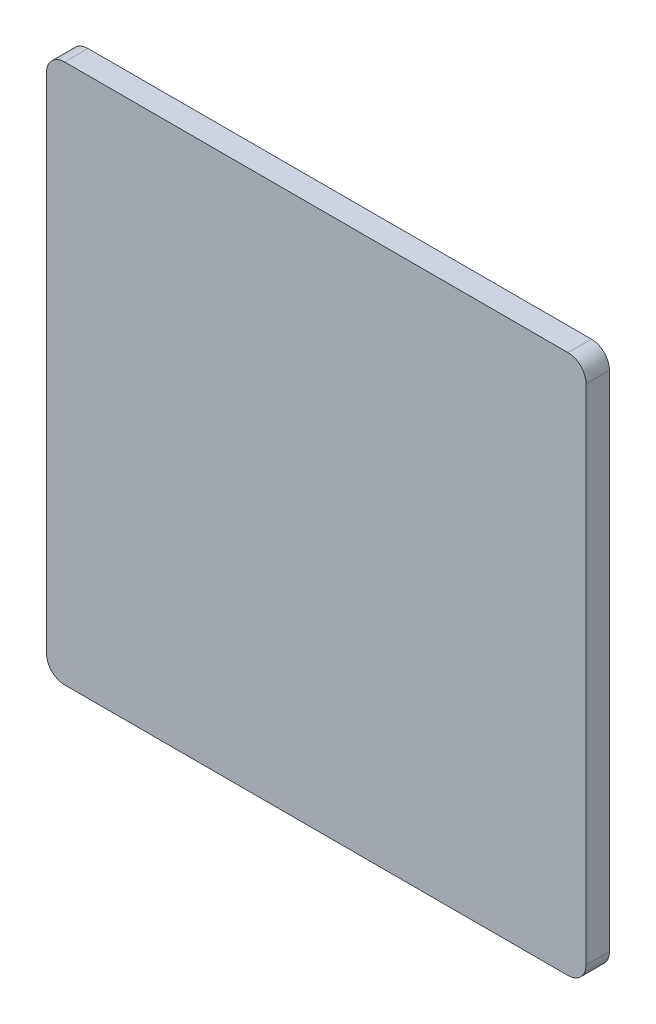
ISO-10303-21;
HEADER;
FILE_DESCRIPTION(('STEP AP214'),'2;1');
FILE_NAME('part.step','',(''),(''),'','','');
FILE_SCHEMA(('AUTOMOTIVE_DESIGN { 1 0 10303 214 1 1 1 1 }'));
ENDSEC;
DATA;
#1=APPLICATION_CONTEXT('core data for automotive mechanical design processes');
#2=APPLICATION_PROTOCOL_DEFINITION('international standard','automotive_design',2000,#1);
#3=PRODUCT_CONTEXT('',#1,'mechanical');
#4=PRODUCT('Part','Part','',(#3));
#5=PRODUCT_RELATED_PRODUCT_CATEGORY('part','',(#4));
#6=PRODUCT_DEFINITION_FORMATION('','',#4);
#7=PRODUCT_DEFINITION_CONTEXT('part definition',#1,'design');
#8=PRODUCT_DEFINITION('design','',#6,#7);
#9=PRODUCT_DEFINITION_SHAPE('','',#8);
#10=(LENGTH_UNIT() NAMED_UNIT(*) SI_UNIT(.MILLI.,.METRE.));
#11=(NAMED_UNIT(*) PLANE_ANGLE_UNIT() SI_UNIT($,.RADIAN.));
#12=(NAMED_UNIT(*) SI_UNIT($,.STERADIAN.) SOLID_ANGLE_UNIT());
#13=UNCERTAINTY_MEASURE_WITH_UNIT(LENGTH_MEASURE(1.E-05),#10,'distance_accuracy_value','');
#14=(GEOMETRIC_REPRESENTATION_CONTEXT(3) GLOBAL_UNCERTAINTY_ASSIGNED_CONTEXT((#13)) GLOBAL_UNIT_ASSIGNED_CONTEXT((#10,
#11,#12)) REPRESENTATION_CONTEXT('',''));
#15=CARTESIAN_POINT('',(0.,0.,0.));
#16=DIRECTION('',(0.,0.,1.));
#17=DIRECTION('',(1.,0.,0.));
#18=AXIS2_PLACEMENT_3D('',#15,#16,#17);
#19=CARTESIAN_POINT('',(0.,0.,0.));
#20=DIRECTION('',(0.,0.,1.));
#21=DIRECTION('',(1.,0.,0.));
#22=AXIS2_PLACEMENT_3D('',#19,#20,#21);
#23=PLANE('',#22);
#24=CARTESIAN_POINT('',(1.4,-1.4,0.));
#25=DIRECTION('',(0.,0.,1.));
#26=DIRECTION('',(0.707106781186548,-0.707106781186548,0.));
#27=AXIS2_PLACEMENT_3D('',#24,#25,#26);
#28=CIRCLE('',#27,0.1);
#29=CARTESIAN_POINT('',(1.4,-1.5,0.));
#30=VERTEX_POINT('',#29);
#31=CARTESIAN_POINT('',(1.5,-1.4,0.));
#32=VERTEX_POINT('',#31);
#33=EDGE_CURVE('E124',#30,#32,#28,.T.);
#34=ORIENTED_EDGE('',*,*,#33,.F.);
#35=DIRECTION('',(1.,0.,0.));
#36=VECTOR('',#35,1.);
#37=CARTESIAN_POINT('',(-1.5,-1.5,0.));
#38=LINE('',#37,#36);
#39=CARTESIAN_POINT('',(-1.4,-1.5,0.));
#40=VERTEX_POINT('',#39);
#41=EDGE_CURVE('E122',#40,#30,#38,.T.);
#42=ORIENTED_EDGE('',*,*,#41,.F.);
#43=CARTESIAN_POINT('',(-1.4,-1.4,0.));
#44=DIRECTION('',(0.,0.,1.));
#45=DIRECTION('',(-0.707106781186548,-0.707106781186548,0.));
#46=AXIS2_PLACEMENT_3D('',#43,#44,#45);
#47=CIRCLE('',#46,0.1);
#48=CARTESIAN_POINT('',(-1.5,-1.4,0.));
#49=VERTEX_POINT('',#48);
#50=EDGE_CURVE('E109',#49,#40,#47,.T.);
#51=ORIENTED_EDGE('',*,*,#50,.F.);
#52=DIRECTION('',(0.,-1.,0.));
#53=VECTOR('',#52,1.);
#54=CARTESIAN_POINT('',(-1.5,1.5,0.));
#55=LINE('',#54,#53);
#56=CARTESIAN_POINT('',(-1.5,1.4,0.));
#57=VERTEX_POINT('',#56);
#58=EDGE_CURVE('E156',#57,#49,#55,.T.);
#59=ORIENTED_EDGE('',*,*,#58,.F.);
#60=CARTESIAN_POINT('',(-1.4,1.4,0.));
#61=DIRECTION('',(0.,0.,1.));
#62=DIRECTION('',(-0.707106781186548,0.707106781186548,0.));
#63=AXIS2_PLACEMENT_3D('',#60,#61,#62);
#64=CIRCLE('',#63,0.1);
#65=CARTESIAN_POINT('',(-1.4,1.5,0.));
#66=VERTEX_POINT('',#65);
#67=EDGE_CURVE('E180',#66,#57,#64,.T.);
#68=ORIENTED_EDGE('',*,*,#67,.F.);
#69=DIRECTION('',(-1.,0.,0.));
#70=VECTOR('',#69,1.);
#71=CARTESIAN_POINT('',(1.5,1.5,0.));
#72=LINE('',#71,#70);
#73=CARTESIAN_POINT('',(1.4,1.5,0.));
#74=VERTEX_POINT('',#73);
#75=EDGE_CURVE('E179',#74,#66,#72,.T.);
#76=ORIENTED_EDGE('',*,*,#75,.F.);
#77=CARTESIAN_POINT('',(1.4,1.4,0.));
#78=DIRECTION('',(0.,0.,1.));
#79=DIRECTION('',(0.707106781186548,0.707106781186548,0.));
#80=AXIS2_PLACEMENT_3D('',#77,#78,#79);
#81=CIRCLE('',#80,0.1);
#82=CARTESIAN_POINT('',(1.5,1.4,0.));
#83=VERTEX_POINT('',#82);
#84=EDGE_CURVE('E27',#83,#74,#81,.T.);
#85=ORIENTED_EDGE('',*,*,#84,.F.);
#86=DIRECTION('',(0.,1.,0.));
#87=VECTOR('',#86,1.);
#88=CARTESIAN_POINT('',(1.5,-1.5,0.));
#89=LINE('',#88,#87);
#90=EDGE_CURVE('E11',#32,#83,#89,.T.);
#91=ORIENTED_EDGE('',*,*,#90,.F.);
#92=EDGE_LOOP('',(#34,#42,#51,#59,#68,#76,#85,#91));
#93=FACE_BOUND('',#92,.T.);
#94=ADVANCED_FACE('F16',(#93),#23,.F.);
#95=CARTESIAN_POINT('',(1.5,-1.5,0.));
#96=DIRECTION('',(1.,0.,0.));
#97=DIRECTION('',(0.,1.,0.));
#98=AXIS2_PLACEMENT_3D('',#95,#96,#97);
#99=PLANE('',#98);
#100=DIRECTION('',(0.,0.,1.));
#101=VECTOR('',#100,1.);
#102=CARTESIAN_POINT('',(1.5,-1.4,0.));
#103=LINE('',#102,#101);
#104=CARTESIAN_POINT('',(1.5,-1.4,0.13));
#105=VERTEX_POINT('',#104);
#106=EDGE_CURVE('E139',#32,#105,#103,.T.);
#107=ORIENTED_EDGE('',*,*,#106,.F.);
#108=ORIENTED_EDGE('',*,*,#90,.T.);
#109=DIRECTION('',(0.,0.,-1.));
#110=VECTOR('',#109,1.);
#111=CARTESIAN_POINT('',(1.5,1.4,0.));
#112=LINE('',#111,#110);
#113=CARTESIAN_POINT('',(1.5,1.4,0.13));
#114=VERTEX_POINT('',#113);
#115=EDGE_CURVE('E163',#114,#83,#112,.T.);
#116=ORIENTED_EDGE('',*,*,#115,.F.);
#117=DIRECTION('',(0.,1.,0.));
#118=VECTOR('',#117,1.);
#119=CARTESIAN_POINT('',(1.5,-1.5,0.13));
#120=LINE('',#119,#118);
#121=EDGE_CURVE('E129',#105,#114,#120,.T.);
#122=ORIENTED_EDGE('',*,*,#121,.F.);
#123=EDGE_LOOP('',(#107,#108,#116,#122));
#124=FACE_BOUND('',#123,.T.);
#125=ADVANCED_FACE('F320',(#124),#99,.T.);
#126=CARTESIAN_POINT('',(1.4,1.4,0.));
#127=DIRECTION('',(0.,0.,1.));
#128=DIRECTION('',(0.707106781186548,0.707106781186548,0.));
#129=AXIS2_PLACEMENT_3D('',#126,#127,#128);
#130=CYLINDRICAL_SURFACE('',#129,0.1);
#131=CARTESIAN_POINT('',(1.4,1.4,0.13));
#132=DIRECTION('',(0.,0.,-1.));
#133=DIRECTION('',(0.707106781186548,0.707106781186548,0.));
#134=AXIS2_PLACEMENT_3D('',#131,#132,#133);
#135=CIRCLE('',#134,0.1);
#136=CARTESIAN_POINT('',(1.4,1.5,0.13));
#137=VERTEX_POINT('',#136);
#138=EDGE_CURVE('E143',#137,#114,#135,.T.);
#139=ORIENTED_EDGE('',*,*,#138,.T.);
#140=ORIENTED_EDGE('',*,*,#115,.T.);
#141=ORIENTED_EDGE('',*,*,#84,.T.);
#142=DIRECTION('',(0.,0.,1.));
#143=VECTOR('',#142,1.);
#144=CARTESIAN_POINT('',(1.4,1.5,0.));
#145=LINE('',#144,#143);
#146=EDGE_CURVE('E176',#74,#137,#145,.T.);
#147=ORIENTED_EDGE('',*,*,#146,.T.);
#148=EDGE_LOOP('',(#139,#140,#141,#147));
#149=FACE_BOUND('',#148,.T.);
#150=ADVANCED_FACE('F203',(#149),#130,.T.);
#151=CARTESIAN_POINT('',(1.5,1.5,0.));
#152=DIRECTION('',(0.,1.,0.));
#153=DIRECTION('',(1.,0.,0.));
#154=AXIS2_PLACEMENT_3D('',#151,#152,#153);
#155=PLANE('',#154);
#156=DIRECTION('',(0.,0.,-1.));
#157=VECTOR('',#156,1.);
#158=CARTESIAN_POINT('',(-1.4,1.5,0.));
#159=LINE('',#158,#157);
#160=CARTESIAN_POINT('',(-1.4,1.5,0.13));
#161=VERTEX_POINT('',#160);
#162=EDGE_CURVE('E20',#161,#66,#159,.T.);
#163=ORIENTED_EDGE('',*,*,#162,.F.);
#164=DIRECTION('',(-1.,0.,0.));
#165=VECTOR('',#164,1.);
#166=CARTESIAN_POINT('',(1.5,1.5,0.13));
#167=LINE('',#166,#165);
#168=EDGE_CURVE('E147',#137,#161,#167,.T.);
#169=ORIENTED_EDGE('',*,*,#168,.F.);
#170=ORIENTED_EDGE('',*,*,#146,.F.);
#171=ORIENTED_EDGE('',*,*,#75,.T.);
#172=EDGE_LOOP('',(#163,#169,#170,#171));
#173=FACE_BOUND('',#172,.T.);
#174=ADVANCED_FACE('F199',(#173),#155,.T.);
#175=CARTESIAN_POINT('',(-1.4,1.4,0.));
#176=DIRECTION('',(0.,0.,1.));
#177=DIRECTION('',(-0.707106781186548,0.707106781186548,0.));
#178=AXIS2_PLACEMENT_3D('',#175,#176,#177);
#179=CYLINDRICAL_SURFACE('',#178,0.1);
#180=CARTESIAN_POINT('',(-1.4,1.4,0.13));
#181=DIRECTION('',(0.,0.,-1.));
#182=DIRECTION('',(-0.707106781186548,0.707106781186548,0.));
#183=AXIS2_PLACEMENT_3D('',#180,#181,#182);
#184=CIRCLE('',#183,0.1);
#185=CARTESIAN_POINT('',(-1.5,1.4,0.13));
#186=VERTEX_POINT('',#185);
#187=EDGE_CURVE('E151',#186,#161,#184,.T.);
#188=ORIENTED_EDGE('',*,*,#187,.T.);
#189=ORIENTED_EDGE('',*,*,#162,.T.);
#190=ORIENTED_EDGE('',*,*,#67,.T.);
#191=DIRECTION('',(0.,0.,1.));
#192=VECTOR('',#191,1.);
#193=CARTESIAN_POINT('',(-1.5,1.4,0.));
#194=LINE('',#193,#192);
#195=EDGE_CURVE('E77',#57,#186,#194,.T.);
#196=ORIENTED_EDGE('',*,*,#195,.T.);
#197=EDGE_LOOP('',(#188,#189,#190,#196));
#198=FACE_BOUND('',#197,.T.);
#199=ADVANCED_FACE('F18',(#198),#179,.T.);
#200=CARTESIAN_POINT('',(-1.5,1.5,0.));
#201=DIRECTION('',(-1.,0.,0.));
#202=DIRECTION('',(0.,0.,1.));
#203=AXIS2_PLACEMENT_3D('',#200,#201,#202);
#204=PLANE('',#203);
#205=DIRECTION('',(0.,0.,-1.));
#206=VECTOR('',#205,1.);
#207=CARTESIAN_POINT('',(-1.5,-1.4,0.));
#208=LINE('',#207,#206);
#209=CARTESIAN_POINT('',(-1.5,-1.4,0.13));
#210=VERTEX_POINT('',#209);
#211=EDGE_CURVE('E116',#210,#49,#208,.T.);
#212=ORIENTED_EDGE('',*,*,#211,.F.);
#213=DIRECTION('',(0.,-1.,0.));
#214=VECTOR('',#213,1.);
#215=CARTESIAN_POINT('',(-1.5,1.5,0.13));
#216=LINE('',#215,#214);
#217=EDGE_CURVE('E160',#186,#210,#216,.T.);
#218=ORIENTED_EDGE('',*,*,#217,.F.);
#219=ORIENTED_EDGE('',*,*,#195,.F.);
#220=ORIENTED_EDGE('',*,*,#58,.T.);
#221=EDGE_LOOP('',(#212,#218,#219,#220));
#222=FACE_BOUND('',#221,.T.);
#223=ADVANCED_FACE('F205',(#222),#204,.T.);
#224=CARTESIAN_POINT('',(-1.4,-1.4,0.));
#225=DIRECTION('',(0.,0.,1.));
#226=DIRECTION('',(-0.707106781186548,-0.707106781186548,0.));
#227=AXIS2_PLACEMENT_3D('',#224,#225,#226);
#228=CYLINDRICAL_SURFACE('',#227,0.1);
#229=CARTESIAN_POINT('',(-1.4,-1.4,0.13));
#230=DIRECTION('',(0.,0.,-1.));
#231=DIRECTION('',(-0.707106781186548,-0.707106781186548,0.));
#232=AXIS2_PLACEMENT_3D('',#229,#230,#231);
#233=CIRCLE('',#232,0.1);
#234=CARTESIAN_POINT('',(-1.4,-1.5,0.13));
#235=VERTEX_POINT('',#234);
#236=EDGE_CURVE('E153',#235,#210,#233,.T.);
#237=ORIENTED_EDGE('',*,*,#236,.T.);
#238=ORIENTED_EDGE('',*,*,#211,.T.);
#239=ORIENTED_EDGE('',*,*,#50,.T.);
#240=DIRECTION('',(0.,0.,1.));
#241=VECTOR('',#240,1.);
#242=CARTESIAN_POINT('',(-1.4,-1.5,0.));
#243=LINE('',#242,#241);
#244=EDGE_CURVE('E114',#40,#235,#243,.T.);
#245=ORIENTED_EDGE('',*,*,#244,.T.);
#246=EDGE_LOOP('',(#237,#238,#239,#245));
#247=FACE_BOUND('',#246,.T.);
#248=ADVANCED_FACE('F112',(#247),#228,.T.);
#249=CARTESIAN_POINT('',(0.,0.,0.13));
#250=DIRECTION('',(0.,0.,1.));
#251=DIRECTION('',(1.,0.,0.));
#252=AXIS2_PLACEMENT_3D('',#249,#250,#251);
#253=PLANE('',#252);
#254=CARTESIAN_POINT('',(1.4,-1.4,0.13));
#255=DIRECTION('',(0.,0.,-1.));
#256=DIRECTION('',(0.707106781186548,-0.707106781186548,0.));
#257=AXIS2_PLACEMENT_3D('',#254,#255,#256);
#258=CIRCLE('',#257,0.1);
#259=CARTESIAN_POINT('',(1.4,-1.5,0.13));
#260=VERTEX_POINT('',#259);
#261=EDGE_CURVE('E169',#105,#260,#258,.T.);
#262=ORIENTED_EDGE('',*,*,#261,.F.);
#263=ORIENTED_EDGE('',*,*,#121,.T.);
#264=ORIENTED_EDGE('',*,*,#138,.F.);
#265=ORIENTED_EDGE('',*,*,#168,.T.);
#266=ORIENTED_EDGE('',*,*,#187,.F.);
#267=ORIENTED_EDGE('',*,*,#217,.T.);
#268=ORIENTED_EDGE('',*,*,#236,.F.);
#269=DIRECTION('',(1.,0.,0.));
#270=VECTOR('',#269,1.);
#271=CARTESIAN_POINT('',(-1.5,-1.5,0.13));
#272=LINE('',#271,#270);
#273=EDGE_CURVE('E132',#235,#260,#272,.T.);
#274=ORIENTED_EDGE('',*,*,#273,.T.);
#275=EDGE_LOOP('',(#262,#263,#264,#265,#266,#267,#268,#274));
#276=FACE_BOUND('',#275,.T.);
#277=ADVANCED_FACE('F196',(#276),#253,.T.);
#278=CARTESIAN_POINT('',(-1.5,-1.5,0.));
#279=DIRECTION('',(0.,-1.,0.));
#280=DIRECTION('',(0.,0.,-1.));
#281=AXIS2_PLACEMENT_3D('',#278,#279,#280);
#282=PLANE('',#281);
#283=DIRECTION('',(0.,0.,-1.));
#284=VECTOR('',#283,1.);
#285=CARTESIAN_POINT('',(1.4,-1.5,0.));
#286=LINE('',#285,#284);
#287=EDGE_CURVE('E146',#260,#30,#286,.T.);
#288=ORIENTED_EDGE('',*,*,#287,.F.);
#289=ORIENTED_EDGE('',*,*,#273,.F.);
#290=ORIENTED_EDGE('',*,*,#244,.F.);
#291=ORIENTED_EDGE('',*,*,#41,.T.);
#292=EDGE_LOOP('',(#288,#289,#290,#291));
#293=FACE_BOUND('',#292,.T.);
#294=ADVANCED_FACE('F131',(#293),#282,.T.);
#295=CARTESIAN_POINT('',(1.4,-1.4,0.));
#296=DIRECTION('',(0.,0.,1.));
#297=DIRECTION('',(0.707106781186548,-0.707106781186548,0.));
#298=AXIS2_PLACEMENT_3D('',#295,#296,#297);
#299=CYLINDRICAL_SURFACE('',#298,0.1);
#300=ORIENTED_EDGE('',*,*,#261,.T.);
#301=ORIENTED_EDGE('',*,*,#287,.T.);
#302=ORIENTED_EDGE('',*,*,#33,.T.);
#303=ORIENTED_EDGE('',*,*,#106,.T.);
#304=EDGE_LOOP('',(#300,#301,#302,#303));
#305=FACE_BOUND('',#304,.T.);
#306=ADVANCED_FACE('F208',(#305),#299,.T.);
#307=CLOSED_SHELL('',(#94,#125,#150,#174,#199,#223,#248,#277,#294,#306));
#308=MANIFOLD_SOLID_BREP('B1',#307);
#309=ADVANCED_BREP_SHAPE_REPRESENTATION('',(#18,#308),#14);
#310=SHAPE_DEFINITION_REPRESENTATION(#9,#309);
ENDSEC;
END-ISO-10303-21;
